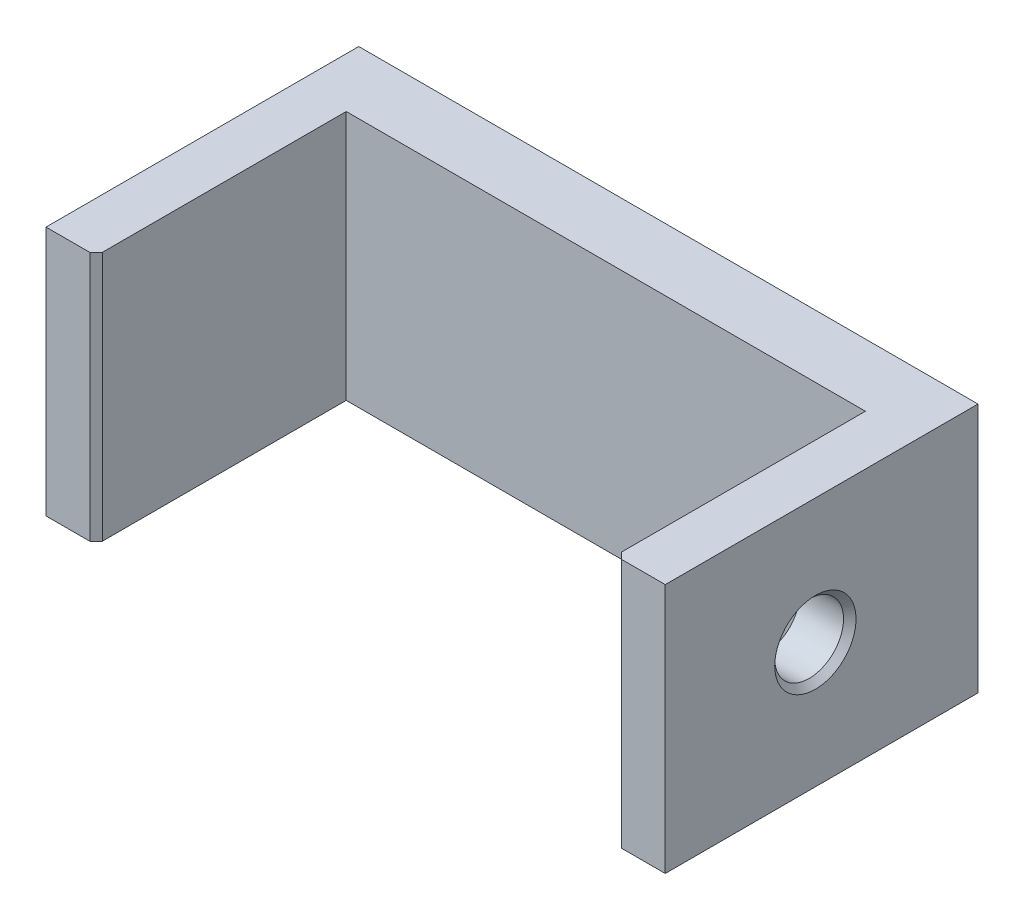
ISO-10303-21;
HEADER;
FILE_DESCRIPTION(('STEP AP214'),'2;1');
FILE_NAME('part.step','',(''),(''),'','','');
FILE_SCHEMA(('AUTOMOTIVE_DESIGN { 1 0 10303 214 1 1 1 1 }'));
ENDSEC;
DATA;
#1=APPLICATION_CONTEXT('core data for automotive mechanical design processes');
#2=APPLICATION_PROTOCOL_DEFINITION('international standard','automotive_design',2000,#1);
#3=PRODUCT_CONTEXT('',#1,'mechanical');
#4=PRODUCT('Part','Part','',(#3));
#5=PRODUCT_RELATED_PRODUCT_CATEGORY('part','',(#4));
#6=PRODUCT_DEFINITION_FORMATION('','',#4);
#7=PRODUCT_DEFINITION_CONTEXT('part definition',#1,'design');
#8=PRODUCT_DEFINITION('design','',#6,#7);
#9=PRODUCT_DEFINITION_SHAPE('','',#8);
#10=(LENGTH_UNIT() NAMED_UNIT(*) SI_UNIT(.MILLI.,.METRE.));
#11=(NAMED_UNIT(*) PLANE_ANGLE_UNIT() SI_UNIT($,.RADIAN.));
#12=(NAMED_UNIT(*) SI_UNIT($,.STERADIAN.) SOLID_ANGLE_UNIT());
#13=UNCERTAINTY_MEASURE_WITH_UNIT(LENGTH_MEASURE(1.E-05),#10,'distance_accuracy_value','');
#14=(GEOMETRIC_REPRESENTATION_CONTEXT(3) GLOBAL_UNCERTAINTY_ASSIGNED_CONTEXT((#13)) GLOBAL_UNIT_ASSIGNED_CONTEXT((#10,
#11,#12)) REPRESENTATION_CONTEXT('',''));
#15=CARTESIAN_POINT('',(0.,0.,0.));
#16=DIRECTION('',(0.,0.,1.));
#17=DIRECTION('',(1.,0.,0.));
#18=AXIS2_PLACEMENT_3D('',#15,#16,#17);
#19=CARTESIAN_POINT('',(0.,0.,5.));
#20=DIRECTION('',(1.,0.,0.));
#21=DIRECTION('',(0.,0.,-1.));
#22=AXIS2_PLACEMENT_3D('',#19,#20,#21);
#23=PLANE('',#22);
#24=DIRECTION('',(0.,-1.,0.));
#25=VECTOR('',#24,1.);
#26=CARTESIAN_POINT('',(0.,0.,0.));
#27=LINE('',#26,#25);
#28=CARTESIAN_POINT('',(0.,0.,0.));
#29=VERTEX_POINT('',#28);
#30=CARTESIAN_POINT('',(0.,-20.,0.));
#31=VERTEX_POINT('',#30);
#32=EDGE_CURVE('E170',#29,#31,#27,.T.);
#33=ORIENTED_EDGE('',*,*,#32,.T.);
#34=DIRECTION('',(0.,0.,-1.));
#35=VECTOR('',#34,1.);
#36=CARTESIAN_POINT('',(0.,-20.,5.));
#37=LINE('',#36,#35);
#38=CARTESIAN_POINT('',(0.,-20.,25.));
#39=VERTEX_POINT('',#38);
#40=EDGE_CURVE('E216',#39,#31,#37,.T.);
#41=ORIENTED_EDGE('',*,*,#40,.F.);
#42=DIRECTION('',(0.,-1.,0.));
#43=VECTOR('',#42,1.);
#44=CARTESIAN_POINT('',(0.,0.,25.));
#45=LINE('',#44,#43);
#46=CARTESIAN_POINT('',(0.,0.,25.));
#47=VERTEX_POINT('',#46);
#48=EDGE_CURVE('E182',#47,#39,#45,.T.);
#49=ORIENTED_EDGE('',*,*,#48,.F.);
#50=DIRECTION('',(0.,0.,-1.));
#51=VECTOR('',#50,1.);
#52=CARTESIAN_POINT('',(0.,0.,5.));
#53=LINE('',#52,#51);
#54=EDGE_CURVE('E137',#47,#29,#53,.T.);
#55=ORIENTED_EDGE('',*,*,#54,.T.);
#56=EDGE_LOOP('',(#33,#41,#49,#55));
#57=FACE_BOUND('',#56,.T.);
#58=ADVANCED_FACE('F47',(#57),#23,.F.);
#59=CARTESIAN_POINT('',(0.,-20.,5.));
#60=DIRECTION('',(0.,1.,0.));
#61=DIRECTION('',(0.,0.,1.));
#62=AXIS2_PLACEMENT_3D('',#59,#60,#61);
#63=PLANE('',#62);
#64=DIRECTION('',(1.,0.,0.));
#65=VECTOR('',#64,1.);
#66=CARTESIAN_POINT('',(49.5,-20.,25.));
#67=LINE('',#66,#65);
#68=CARTESIAN_POINT('',(46.,-20.,25.));
#69=VERTEX_POINT('',#68);
#70=CARTESIAN_POINT('',(49.5,-20.,25.));
#71=VERTEX_POINT('',#70);
#72=EDGE_CURVE('E149',#69,#71,#67,.T.);
#73=ORIENTED_EDGE('',*,*,#72,.F.);
#74=DIRECTION('',(-0.707106781186548,0.,-0.707106781186548));
#75=VECTOR('',#74,1.);
#76=CARTESIAN_POINT('',(46.,-20.,25.));
#77=LINE('',#76,#75);
#78=CARTESIAN_POINT('',(45.5,-20.,24.5));
#79=VERTEX_POINT('',#78);
#80=EDGE_CURVE('E226',#69,#79,#77,.T.);
#81=ORIENTED_EDGE('',*,*,#80,.T.);
#82=DIRECTION('',(0.,0.,-1.));
#83=VECTOR('',#82,1.);
#84=CARTESIAN_POINT('',(45.5,-20.,25.));
#85=LINE('',#84,#83);
#86=CARTESIAN_POINT('',(45.5,-20.,5.));
#87=VERTEX_POINT('',#86);
#88=EDGE_CURVE('E163',#79,#87,#85,.T.);
#89=ORIENTED_EDGE('',*,*,#88,.T.);
#90=DIRECTION('',(1.,0.,0.));
#91=VECTOR('',#90,1.);
#92=CARTESIAN_POINT('',(0.,-20.,5.));
#93=LINE('',#92,#91);
#94=CARTESIAN_POINT('',(4.,-20.,5.));
#95=VERTEX_POINT('',#94);
#96=EDGE_CURVE('E192',#95,#87,#93,.T.);
#97=ORIENTED_EDGE('',*,*,#96,.F.);
#98=DIRECTION('',(0.,0.,-1.));
#99=VECTOR('',#98,1.);
#100=CARTESIAN_POINT('',(4.,-20.,25.));
#101=LINE('',#100,#99);
#102=CARTESIAN_POINT('',(4.,-20.,24.5));
#103=VERTEX_POINT('',#102);
#104=EDGE_CURVE('E171',#103,#95,#101,.T.);
#105=ORIENTED_EDGE('',*,*,#104,.F.);
#106=DIRECTION('',(-0.707106781186548,0.,0.707106781186548));
#107=VECTOR('',#106,1.);
#108=CARTESIAN_POINT('',(3.49999999999999,-20.,25.));
#109=LINE('',#108,#107);
#110=CARTESIAN_POINT('',(3.5,-20.,25.));
#111=VERTEX_POINT('',#110);
#112=EDGE_CURVE('E223',#103,#111,#109,.T.);
#113=ORIENTED_EDGE('',*,*,#112,.T.);
#114=DIRECTION('',(1.,0.,0.));
#115=VECTOR('',#114,1.);
#116=CARTESIAN_POINT('',(0.,-20.,25.));
#117=LINE('',#116,#115);
#118=EDGE_CURVE('E185',#39,#111,#117,.T.);
#119=ORIENTED_EDGE('',*,*,#118,.F.);
#120=ORIENTED_EDGE('',*,*,#40,.T.);
#121=DIRECTION('',(1.,0.,0.));
#122=VECTOR('',#121,1.);
#123=CARTESIAN_POINT('',(0.,-20.,0.));
#124=LINE('',#123,#122);
#125=CARTESIAN_POINT('',(49.5,-20.,0.));
#126=VERTEX_POINT('',#125);
#127=EDGE_CURVE('E204',#31,#126,#124,.T.);
#128=ORIENTED_EDGE('',*,*,#127,.T.);
#129=DIRECTION('',(0.,0.,-1.));
#130=VECTOR('',#129,1.);
#131=CARTESIAN_POINT('',(49.5,-20.,5.));
#132=LINE('',#131,#130);
#133=EDGE_CURVE('E136',#71,#126,#132,.T.);
#134=ORIENTED_EDGE('',*,*,#133,.F.);
#135=EDGE_LOOP('',(#73,#81,#89,#97,#105,#113,#119,#120,#128,#134));
#136=FACE_BOUND('',#135,.T.);
#137=ADVANCED_FACE('F260',(#136),#63,.F.);
#138=CARTESIAN_POINT('',(49.5,0.,5.));
#139=DIRECTION('',(-1.,0.,0.));
#140=DIRECTION('',(0.,0.,1.));
#141=AXIS2_PLACEMENT_3D('',#138,#139,#140);
#142=PLANE('',#141);
#143=CARTESIAN_POINT('',(49.5,-10.,13.));
#144=DIRECTION('',(-1.,0.,0.));
#145=DIRECTION('',(0.,0.,1.));
#146=AXIS2_PLACEMENT_3D('',#143,#144,#145);
#147=CIRCLE('',#146,3.24999999999999);
#148=CARTESIAN_POINT('',(49.5,-10.,16.25));
#149=VERTEX_POINT('',#148);
#150=EDGE_CURVE('E11',#149,#149,#147,.T.);
#151=ORIENTED_EDGE('',*,*,#150,.T.);
#152=EDGE_LOOP('',(#151));
#153=FACE_BOUND('',#152,.T.);
#154=DIRECTION('',(0.,1.,0.));
#155=VECTOR('',#154,1.);
#156=CARTESIAN_POINT('',(49.5,0.,0.));
#157=LINE('',#156,#155);
#158=CARTESIAN_POINT('',(49.5,0.,0.));
#159=VERTEX_POINT('',#158);
#160=EDGE_CURVE('E133',#126,#159,#157,.T.);
#161=ORIENTED_EDGE('',*,*,#160,.T.);
#162=DIRECTION('',(0.,0.,-1.));
#163=VECTOR('',#162,1.);
#164=CARTESIAN_POINT('',(49.5,0.,5.));
#165=LINE('',#164,#163);
#166=CARTESIAN_POINT('',(49.5,0.,25.));
#167=VERTEX_POINT('',#166);
#168=EDGE_CURVE('E126',#167,#159,#165,.T.);
#169=ORIENTED_EDGE('',*,*,#168,.F.);
#170=DIRECTION('',(0.,1.,0.));
#171=VECTOR('',#170,1.);
#172=CARTESIAN_POINT('',(49.5,-20.,25.));
#173=LINE('',#172,#171);
#174=EDGE_CURVE('E131',#71,#167,#173,.T.);
#175=ORIENTED_EDGE('',*,*,#174,.F.);
#176=ORIENTED_EDGE('',*,*,#133,.T.);
#177=EDGE_LOOP('',(#161,#169,#175,#176));
#178=FACE_BOUND('',#177,.T.);
#179=ADVANCED_FACE('F128',(#153,#178),#142,.F.);
#180=CARTESIAN_POINT('',(0.,0.,5.));
#181=DIRECTION('',(0.,-1.,0.));
#182=DIRECTION('',(0.,0.,-1.));
#183=AXIS2_PLACEMENT_3D('',#180,#181,#182);
#184=PLANE('',#183);
#185=DIRECTION('',(0.,0.,-1.));
#186=VECTOR('',#185,1.);
#187=CARTESIAN_POINT('',(45.5,0.,25.));
#188=LINE('',#187,#186);
#189=CARTESIAN_POINT('',(45.5,0.,24.5));
#190=VERTEX_POINT('',#189);
#191=CARTESIAN_POINT('',(45.5,0.,5.));
#192=VERTEX_POINT('',#191);
#193=EDGE_CURVE('E167',#190,#192,#188,.T.);
#194=ORIENTED_EDGE('',*,*,#193,.F.);
#195=DIRECTION('',(0.707106781186548,0.,0.707106781186548));
#196=VECTOR('',#195,1.);
#197=CARTESIAN_POINT('',(46.,0.,25.));
#198=LINE('',#197,#196);
#199=CARTESIAN_POINT('',(46.,0.,25.));
#200=VERTEX_POINT('',#199);
#201=EDGE_CURVE('E144',#190,#200,#198,.T.);
#202=ORIENTED_EDGE('',*,*,#201,.T.);
#203=DIRECTION('',(-1.,0.,0.));
#204=VECTOR('',#203,1.);
#205=CARTESIAN_POINT('',(49.5,0.,25.));
#206=LINE('',#205,#204);
#207=EDGE_CURVE('E140',#167,#200,#206,.T.);
#208=ORIENTED_EDGE('',*,*,#207,.F.);
#209=ORIENTED_EDGE('',*,*,#168,.T.);
#210=DIRECTION('',(-1.,0.,0.));
#211=VECTOR('',#210,1.);
#212=CARTESIAN_POINT('',(0.,0.,0.));
#213=LINE('',#212,#211);
#214=EDGE_CURVE('E197',#159,#29,#213,.T.);
#215=ORIENTED_EDGE('',*,*,#214,.T.);
#216=ORIENTED_EDGE('',*,*,#54,.F.);
#217=DIRECTION('',(-1.,0.,0.));
#218=VECTOR('',#217,1.);
#219=CARTESIAN_POINT('',(0.,0.,25.));
#220=LINE('',#219,#218);
#221=CARTESIAN_POINT('',(3.49999999999999,0.,25.));
#222=VERTEX_POINT('',#221);
#223=EDGE_CURVE('E178',#222,#47,#220,.T.);
#224=ORIENTED_EDGE('',*,*,#223,.F.);
#225=DIRECTION('',(0.707106781186548,0.,-0.707106781186548));
#226=VECTOR('',#225,1.);
#227=CARTESIAN_POINT('',(3.49999999999999,0.,25.));
#228=LINE('',#227,#226);
#229=CARTESIAN_POINT('',(4.,0.,24.5));
#230=VERTEX_POINT('',#229);
#231=EDGE_CURVE('E64',#222,#230,#228,.T.);
#232=ORIENTED_EDGE('',*,*,#231,.T.);
#233=DIRECTION('',(0.,0.,-1.));
#234=VECTOR('',#233,1.);
#235=CARTESIAN_POINT('',(4.,0.,25.));
#236=LINE('',#235,#234);
#237=CARTESIAN_POINT('',(4.,0.,5.));
#238=VERTEX_POINT('',#237);
#239=EDGE_CURVE('E174',#230,#238,#236,.T.);
#240=ORIENTED_EDGE('',*,*,#239,.T.);
#241=DIRECTION('',(-1.,0.,0.));
#242=VECTOR('',#241,1.);
#243=CARTESIAN_POINT('',(0.,0.,5.));
#244=LINE('',#243,#242);
#245=EDGE_CURVE('E196',#192,#238,#244,.T.);
#246=ORIENTED_EDGE('',*,*,#245,.F.);
#247=EDGE_LOOP('',(#194,#202,#208,#209,#215,#216,#224,#232,#240,#246));
#248=FACE_BOUND('',#247,.T.);
#249=ADVANCED_FACE('F142',(#248),#184,.F.);
#250=CARTESIAN_POINT('',(0.,0.,5.));
#251=DIRECTION('',(0.,0.,1.));
#252=DIRECTION('',(1.,0.,0.));
#253=AXIS2_PLACEMENT_3D('',#250,#251,#252);
#254=PLANE('',#253);
#255=DIRECTION('',(0.,-1.,0.));
#256=VECTOR('',#255,1.);
#257=CARTESIAN_POINT('',(45.5,-20.,5.));
#258=LINE('',#257,#256);
#259=EDGE_CURVE('E155',#192,#87,#258,.T.);
#260=ORIENTED_EDGE('',*,*,#259,.F.);
#261=ORIENTED_EDGE('',*,*,#245,.T.);
#262=DIRECTION('',(0.,1.,0.));
#263=VECTOR('',#262,1.);
#264=CARTESIAN_POINT('',(4.,0.,5.));
#265=LINE('',#264,#263);
#266=EDGE_CURVE('E159',#95,#238,#265,.T.);
#267=ORIENTED_EDGE('',*,*,#266,.F.);
#268=ORIENTED_EDGE('',*,*,#96,.T.);
#269=EDGE_LOOP('',(#260,#261,#267,#268));
#270=FACE_BOUND('',#269,.T.);
#271=ADVANCED_FACE('F297',(#270),#254,.T.);
#272=CARTESIAN_POINT('',(0.,0.,0.));
#273=DIRECTION('',(0.,0.,1.));
#274=DIRECTION('',(1.,0.,0.));
#275=AXIS2_PLACEMENT_3D('',#272,#273,#274);
#276=PLANE('',#275);
#277=ORIENTED_EDGE('',*,*,#32,.F.);
#278=ORIENTED_EDGE('',*,*,#214,.F.);
#279=ORIENTED_EDGE('',*,*,#160,.F.);
#280=ORIENTED_EDGE('',*,*,#127,.F.);
#281=EDGE_LOOP('',(#277,#278,#279,#280));
#282=FACE_BOUND('',#281,.T.);
#283=ADVANCED_FACE('F295',(#282),#276,.F.);
#284=CARTESIAN_POINT('',(4.,0.,25.));
#285=DIRECTION('',(-1.,0.,0.));
#286=DIRECTION('',(0.,-1.,0.));
#287=AXIS2_PLACEMENT_3D('',#284,#285,#286);
#288=PLANE('',#287);
#289=ORIENTED_EDGE('',*,*,#239,.F.);
#290=DIRECTION('',(0.,-1.,0.));
#291=VECTOR('',#290,1.);
#292=CARTESIAN_POINT('',(4.,-20.,24.5));
#293=LINE('',#292,#291);
#294=EDGE_CURVE('E239',#230,#103,#293,.T.);
#295=ORIENTED_EDGE('',*,*,#294,.T.);
#296=ORIENTED_EDGE('',*,*,#104,.T.);
#297=ORIENTED_EDGE('',*,*,#266,.T.);
#298=EDGE_LOOP('',(#289,#295,#296,#297));
#299=FACE_BOUND('',#298,.T.);
#300=ADVANCED_FACE('F296',(#299),#288,.F.);
#301=CARTESIAN_POINT('',(0.,0.,25.));
#302=DIRECTION('',(0.,0.,1.));
#303=DIRECTION('',(1.,0.,0.));
#304=AXIS2_PLACEMENT_3D('',#301,#302,#303);
#305=PLANE('',#304);
#306=ORIENTED_EDGE('',*,*,#118,.T.);
#307=DIRECTION('',(0.,1.,0.));
#308=VECTOR('',#307,1.);
#309=CARTESIAN_POINT('',(3.49999999999999,0.,25.));
#310=LINE('',#309,#308);
#311=EDGE_CURVE('E236',#111,#222,#310,.T.);
#312=ORIENTED_EDGE('',*,*,#311,.T.);
#313=ORIENTED_EDGE('',*,*,#223,.T.);
#314=ORIENTED_EDGE('',*,*,#48,.T.);
#315=EDGE_LOOP('',(#306,#312,#313,#314));
#316=FACE_BOUND('',#315,.T.);
#317=ADVANCED_FACE('F290',(#316),#305,.T.);
#318=CARTESIAN_POINT('',(45.5,-20.,25.));
#319=DIRECTION('',(1.,0.,0.));
#320=DIRECTION('',(0.,0.,-1.));
#321=AXIS2_PLACEMENT_3D('',#318,#319,#320);
#322=PLANE('',#321);
#323=CARTESIAN_POINT('',(45.5,-10.,13.));
#324=DIRECTION('',(1.,0.,0.));
#325=DIRECTION('',(0.,0.,-1.));
#326=AXIS2_PLACEMENT_3D('',#323,#324,#325);
#327=CIRCLE('',#326,2.75);
#328=CARTESIAN_POINT('',(45.5,-10.,10.25));
#329=VERTEX_POINT('',#328);
#330=EDGE_CURVE('E175',#329,#329,#327,.T.);
#331=ORIENTED_EDGE('',*,*,#330,.T.);
#332=EDGE_LOOP('',(#331));
#333=FACE_BOUND('',#332,.T.);
#334=ORIENTED_EDGE('',*,*,#88,.F.);
#335=DIRECTION('',(0.,1.,0.));
#336=VECTOR('',#335,1.);
#337=CARTESIAN_POINT('',(45.5,0.,24.5));
#338=LINE('',#337,#336);
#339=EDGE_CURVE('E229',#79,#190,#338,.T.);
#340=ORIENTED_EDGE('',*,*,#339,.T.);
#341=ORIENTED_EDGE('',*,*,#193,.T.);
#342=ORIENTED_EDGE('',*,*,#259,.T.);
#343=EDGE_LOOP('',(#334,#340,#341,#342));
#344=FACE_BOUND('',#343,.T.);
#345=ADVANCED_FACE('F318',(#333,#344),#322,.F.);
#346=CARTESIAN_POINT('',(0.,0.,25.));
#347=DIRECTION('',(0.,0.,1.));
#348=DIRECTION('',(1.,0.,0.));
#349=AXIS2_PLACEMENT_3D('',#346,#347,#348);
#350=PLANE('',#349);
#351=ORIENTED_EDGE('',*,*,#207,.T.);
#352=DIRECTION('',(0.,-1.,0.));
#353=VECTOR('',#352,1.);
#354=CARTESIAN_POINT('',(46.,-20.,25.));
#355=LINE('',#354,#353);
#356=EDGE_CURVE('E220',#200,#69,#355,.T.);
#357=ORIENTED_EDGE('',*,*,#356,.T.);
#358=ORIENTED_EDGE('',*,*,#72,.T.);
#359=ORIENTED_EDGE('',*,*,#174,.T.);
#360=EDGE_LOOP('',(#351,#357,#358,#359));
#361=FACE_BOUND('',#360,.T.);
#362=ADVANCED_FACE('F151',(#361),#350,.T.);
#363=CARTESIAN_POINT('',(46.,0.,25.));
#364=DIRECTION('',(-0.707106781186547,0.,0.707106781186547));
#365=DIRECTION('',(0.,1.,0.));
#366=AXIS2_PLACEMENT_3D('',#363,#364,#365);
#367=PLANE('',#366);
#368=ORIENTED_EDGE('',*,*,#201,.F.);
#369=ORIENTED_EDGE('',*,*,#339,.F.);
#370=ORIENTED_EDGE('',*,*,#80,.F.);
#371=ORIENTED_EDGE('',*,*,#356,.F.);
#372=EDGE_LOOP('',(#368,#369,#370,#371));
#373=FACE_BOUND('',#372,.T.);
#374=ADVANCED_FACE('F273',(#373),#367,.T.);
#375=CARTESIAN_POINT('',(3.49999999999999,0.,25.));
#376=DIRECTION('',(0.707106781186547,0.,0.707106781186547));
#377=DIRECTION('',(0.,-1.,0.));
#378=AXIS2_PLACEMENT_3D('',#375,#376,#377);
#379=PLANE('',#378);
#380=ORIENTED_EDGE('',*,*,#112,.F.);
#381=ORIENTED_EDGE('',*,*,#294,.F.);
#382=ORIENTED_EDGE('',*,*,#231,.F.);
#383=ORIENTED_EDGE('',*,*,#311,.F.);
#384=EDGE_LOOP('',(#380,#381,#382,#383));
#385=FACE_BOUND('',#384,.T.);
#386=ADVANCED_FACE('F256',(#385),#379,.T.);
#387=CARTESIAN_POINT('',(29.5,-10.,13.));
#388=DIRECTION('',(1.,0.,0.));
#389=DIRECTION('',(0.,0.,-1.));
#390=AXIS2_PLACEMENT_3D('',#387,#388,#389);
#391=CYLINDRICAL_SURFACE('',#390,2.75);
#392=CARTESIAN_POINT('',(49.,-10.,13.));
#393=DIRECTION('',(-1.,0.,0.));
#394=DIRECTION('',(0.,0.,1.));
#395=AXIS2_PLACEMENT_3D('',#392,#393,#394);
#396=CIRCLE('',#395,2.75);
#397=CARTESIAN_POINT('',(49.,-10.,15.75));
#398=VERTEX_POINT('',#397);
#399=EDGE_CURVE('E57',#398,#398,#396,.F.);
#400=ORIENTED_EDGE('',*,*,#399,.T.);
#401=EDGE_LOOP('',(#400));
#402=FACE_BOUND('',#401,.T.);
#403=ORIENTED_EDGE('',*,*,#330,.F.);
#404=EDGE_LOOP('',(#403));
#405=FACE_BOUND('',#404,.T.);
#406=ADVANCED_FACE('F248',(#402,#405),#391,.F.);
#407=CARTESIAN_POINT('',(49.,-10.,13.));
#408=DIRECTION('',(1.,0.,0.));
#409=DIRECTION('',(0.,0.,-1.));
#410=AXIS2_PLACEMENT_3D('',#407,#408,#409);
#411=CONICAL_SURFACE('',#410,2.75,0.785398163397446);
#412=ORIENTED_EDGE('',*,*,#150,.F.);
#413=EDGE_LOOP('',(#412));
#414=FACE_BOUND('',#413,.T.);
#415=ORIENTED_EDGE('',*,*,#399,.F.);
#416=EDGE_LOOP('',(#415));
#417=FACE_BOUND('',#416,.T.);
#418=ADVANCED_FACE('F50',(#414,#417),#411,.F.);
#419=CLOSED_SHELL('',(#58,#137,#179,#249,#271,#283,#300,#317,#345,#362,#374,#386,#406,#418));
#420=MANIFOLD_SOLID_BREP('B2',#419);
#421=ADVANCED_BREP_SHAPE_REPRESENTATION('',(#18,#420),#14);
#422=SHAPE_DEFINITION_REPRESENTATION(#9,#421);
ENDSEC;
END-ISO-10303-21;
